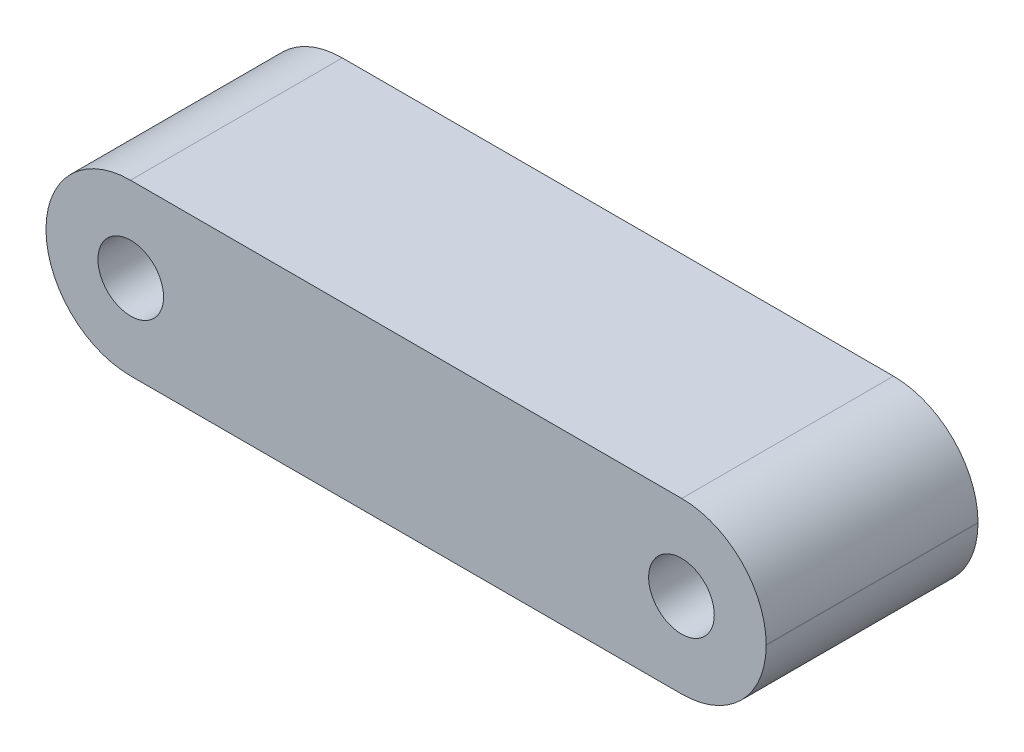
ISO-10303-21;
HEADER;
FILE_DESCRIPTION(('STEP AP214'),'2;1');
FILE_NAME('part.step','',(''),(''),'','','');
FILE_SCHEMA(('AUTOMOTIVE_DESIGN { 1 0 10303 214 1 1 1 1 }'));
ENDSEC;
DATA;
#1=APPLICATION_CONTEXT('core data for automotive mechanical design processes');
#2=APPLICATION_PROTOCOL_DEFINITION('international standard','automotive_design',2000,#1);
#3=PRODUCT_CONTEXT('',#1,'mechanical');
#4=PRODUCT('Part','Part','',(#3));
#5=PRODUCT_RELATED_PRODUCT_CATEGORY('part','',(#4));
#6=PRODUCT_DEFINITION_FORMATION('','',#4);
#7=PRODUCT_DEFINITION_CONTEXT('part definition',#1,'design');
#8=PRODUCT_DEFINITION('design','',#6,#7);
#9=PRODUCT_DEFINITION_SHAPE('','',#8);
#10=(LENGTH_UNIT() NAMED_UNIT(*) SI_UNIT(.MILLI.,.METRE.));
#11=(NAMED_UNIT(*) PLANE_ANGLE_UNIT() SI_UNIT($,.RADIAN.));
#12=(NAMED_UNIT(*) SI_UNIT($,.STERADIAN.) SOLID_ANGLE_UNIT());
#13=UNCERTAINTY_MEASURE_WITH_UNIT(LENGTH_MEASURE(1.E-05),#10,'distance_accuracy_value','');
#14=(GEOMETRIC_REPRESENTATION_CONTEXT(3) GLOBAL_UNCERTAINTY_ASSIGNED_CONTEXT((#13)) GLOBAL_UNIT_ASSIGNED_CONTEXT((#10,
#11,#12)) REPRESENTATION_CONTEXT('',''));
#15=CARTESIAN_POINT('',(0.,0.,0.));
#16=DIRECTION('',(0.,0.,1.));
#17=DIRECTION('',(1.,0.,0.));
#18=AXIS2_PLACEMENT_3D('',#15,#16,#17);
#19=CARTESIAN_POINT('',(126.29,97.1743117146727,10.));
#20=DIRECTION('',(0.,0.,-1.));
#21=DIRECTION('',(-1.,0.,0.));
#22=AXIS2_PLACEMENT_3D('',#19,#20,#21);
#23=CYLINDRICAL_SURFACE('',#22,3.98999999999999);
#24=CARTESIAN_POINT('',(126.29,97.1743117146727,0.));
#25=DIRECTION('',(0.,0.,1.));
#26=DIRECTION('',(1.,0.,0.));
#27=AXIS2_PLACEMENT_3D('',#24,#25,#26);
#28=CIRCLE('',#27,3.98999999999999);
#29=CARTESIAN_POINT('',(122.3,97.1743117146727,0.));
#30=VERTEX_POINT('',#29);
#31=CARTESIAN_POINT('',(126.29,93.1843117146727,0.));
#32=VERTEX_POINT('',#31);
#33=EDGE_CURVE('E131',#30,#32,#28,.T.);
#34=ORIENTED_EDGE('',*,*,#33,.T.);
#35=DIRECTION('',(0.,0.,-1.));
#36=VECTOR('',#35,1.);
#37=CARTESIAN_POINT('',(126.29,93.1843117146727,10.));
#38=LINE('',#37,#36);
#39=CARTESIAN_POINT('',(126.29,93.1843117146727,10.));
#40=VERTEX_POINT('',#39);
#41=EDGE_CURVE('E11',#40,#32,#38,.T.);
#42=ORIENTED_EDGE('',*,*,#41,.F.);
#43=CARTESIAN_POINT('',(126.29,97.1743117146727,10.));
#44=DIRECTION('',(0.,0.,1.));
#45=DIRECTION('',(1.,0.,0.));
#46=AXIS2_PLACEMENT_3D('',#43,#44,#45);
#47=CIRCLE('',#46,3.98999999999999);
#48=CARTESIAN_POINT('',(122.3,97.1743117146727,10.));
#49=VERTEX_POINT('',#48);
#50=EDGE_CURVE('E146',#49,#40,#47,.T.);
#51=ORIENTED_EDGE('',*,*,#50,.F.);
#52=DIRECTION('',(0.,0.,-1.));
#53=VECTOR('',#52,1.);
#54=CARTESIAN_POINT('',(122.3,97.1743117146727,10.));
#55=LINE('',#54,#53);
#56=EDGE_CURVE('E127',#49,#30,#55,.T.);
#57=ORIENTED_EDGE('',*,*,#56,.T.);
#58=EDGE_LOOP('',(#34,#42,#51,#57));
#59=FACE_BOUND('',#58,.T.);
#60=ADVANCED_FACE('F35',(#59),#23,.T.);
#61=CARTESIAN_POINT('',(152.31,93.1843117146727,10.));
#62=DIRECTION('',(0.,1.,0.));
#63=DIRECTION('',(0.,0.,1.));
#64=AXIS2_PLACEMENT_3D('',#61,#62,#63);
#65=PLANE('',#64);
#66=DIRECTION('',(1.,0.,0.));
#67=VECTOR('',#66,1.);
#68=CARTESIAN_POINT('',(152.31,93.1843117146727,0.));
#69=LINE('',#68,#67);
#70=CARTESIAN_POINT('',(152.31,93.1843117146727,0.));
#71=VERTEX_POINT('',#70);
#72=EDGE_CURVE('E134',#32,#71,#69,.T.);
#73=ORIENTED_EDGE('',*,*,#72,.T.);
#74=DIRECTION('',(0.,0.,-1.));
#75=VECTOR('',#74,1.);
#76=CARTESIAN_POINT('',(152.31,93.1843117146727,10.));
#77=LINE('',#76,#75);
#78=CARTESIAN_POINT('',(152.31,93.1843117146727,10.));
#79=VERTEX_POINT('',#78);
#80=EDGE_CURVE('E43',#79,#71,#77,.T.);
#81=ORIENTED_EDGE('',*,*,#80,.F.);
#82=DIRECTION('',(1.,0.,0.));
#83=VECTOR('',#82,1.);
#84=CARTESIAN_POINT('',(152.31,93.1843117146727,10.));
#85=LINE('',#84,#83);
#86=EDGE_CURVE('E94',#40,#79,#85,.T.);
#87=ORIENTED_EDGE('',*,*,#86,.F.);
#88=ORIENTED_EDGE('',*,*,#41,.T.);
#89=EDGE_LOOP('',(#73,#81,#87,#88));
#90=FACE_BOUND('',#89,.T.);
#91=ADVANCED_FACE('F215',(#90),#65,.F.);
#92=CARTESIAN_POINT('',(152.31,97.1743117146727,10.));
#93=DIRECTION('',(0.,0.,-1.));
#94=DIRECTION('',(-1.,0.,0.));
#95=AXIS2_PLACEMENT_3D('',#92,#93,#94);
#96=CYLINDRICAL_SURFACE('',#95,3.98999999999999);
#97=CARTESIAN_POINT('',(152.31,97.1743117146727,0.));
#98=DIRECTION('',(0.,0.,1.));
#99=DIRECTION('',(-1.,0.,0.));
#100=AXIS2_PLACEMENT_3D('',#97,#98,#99);
#101=CIRCLE('',#100,3.98999999999999);
#102=CARTESIAN_POINT('',(156.3,97.1743117146727,0.));
#103=VERTEX_POINT('',#102);
#104=EDGE_CURVE('E137',#71,#103,#101,.T.);
#105=ORIENTED_EDGE('',*,*,#104,.T.);
#106=DIRECTION('',(0.,0.,-1.));
#107=VECTOR('',#106,1.);
#108=CARTESIAN_POINT('',(156.3,97.1743117146727,10.));
#109=LINE('',#108,#107);
#110=CARTESIAN_POINT('',(156.3,97.1743117146727,10.));
#111=VERTEX_POINT('',#110);
#112=EDGE_CURVE('E153',#111,#103,#109,.T.);
#113=ORIENTED_EDGE('',*,*,#112,.F.);
#114=CARTESIAN_POINT('',(152.31,97.1743117146727,10.));
#115=DIRECTION('',(0.,0.,1.));
#116=DIRECTION('',(-1.,0.,0.));
#117=AXIS2_PLACEMENT_3D('',#114,#115,#116);
#118=CIRCLE('',#117,3.98999999999999);
#119=EDGE_CURVE('E161',#79,#111,#118,.T.);
#120=ORIENTED_EDGE('',*,*,#119,.F.);
#121=ORIENTED_EDGE('',*,*,#80,.T.);
#122=EDGE_LOOP('',(#105,#113,#120,#121));
#123=FACE_BOUND('',#122,.T.);
#124=ADVANCED_FACE('F159',(#123),#96,.T.);
#125=CARTESIAN_POINT('',(156.3,97.1943117146728,10.));
#126=DIRECTION('',(-1.,0.,0.));
#127=DIRECTION('',(0.,0.,1.));
#128=AXIS2_PLACEMENT_3D('',#125,#126,#127);
#129=PLANE('',#128);
#130=DIRECTION('',(0.,1.,0.));
#131=VECTOR('',#130,1.);
#132=CARTESIAN_POINT('',(156.3,97.1943117146728,0.));
#133=LINE('',#132,#131);
#134=CARTESIAN_POINT('',(156.3,97.1943117146728,0.));
#135=VERTEX_POINT('',#134);
#136=EDGE_CURVE('E139',#103,#135,#133,.T.);
#137=ORIENTED_EDGE('',*,*,#136,.T.);
#138=DIRECTION('',(0.,0.,-1.));
#139=VECTOR('',#138,1.);
#140=CARTESIAN_POINT('',(156.3,97.1943117146728,10.));
#141=LINE('',#140,#139);
#142=CARTESIAN_POINT('',(156.3,97.1943117146728,10.));
#143=VERTEX_POINT('',#142);
#144=EDGE_CURVE('E150',#143,#135,#141,.T.);
#145=ORIENTED_EDGE('',*,*,#144,.F.);
#146=DIRECTION('',(0.,1.,0.));
#147=VECTOR('',#146,1.);
#148=CARTESIAN_POINT('',(156.3,97.1943117146728,10.));
#149=LINE('',#148,#147);
#150=EDGE_CURVE('E173',#111,#143,#149,.T.);
#151=ORIENTED_EDGE('',*,*,#150,.F.);
#152=ORIENTED_EDGE('',*,*,#112,.T.);
#153=EDGE_LOOP('',(#137,#145,#151,#152));
#154=FACE_BOUND('',#153,.T.);
#155=ADVANCED_FACE('F169',(#154),#129,.F.);
#156=CARTESIAN_POINT('',(152.31,97.1943117146728,10.));
#157=DIRECTION('',(0.,0.,-1.));
#158=DIRECTION('',(-1.,0.,0.));
#159=AXIS2_PLACEMENT_3D('',#156,#157,#158);
#160=CYLINDRICAL_SURFACE('',#159,3.98999999999999);
#161=CARTESIAN_POINT('',(152.31,97.1943117146728,0.));
#162=DIRECTION('',(0.,0.,1.));
#163=DIRECTION('',(1.,0.,0.));
#164=AXIS2_PLACEMENT_3D('',#161,#162,#163);
#165=CIRCLE('',#164,3.98999999999999);
#166=CARTESIAN_POINT('',(152.31,101.184311714673,0.));
#167=VERTEX_POINT('',#166);
#168=EDGE_CURVE('E141',#135,#167,#165,.T.);
#169=ORIENTED_EDGE('',*,*,#168,.T.);
#170=DIRECTION('',(0.,0.,-1.));
#171=VECTOR('',#170,1.);
#172=CARTESIAN_POINT('',(152.31,101.184311714673,10.));
#173=LINE('',#172,#171);
#174=CARTESIAN_POINT('',(152.31,101.184311714673,10.));
#175=VERTEX_POINT('',#174);
#176=EDGE_CURVE('E122',#175,#167,#173,.T.);
#177=ORIENTED_EDGE('',*,*,#176,.F.);
#178=CARTESIAN_POINT('',(152.31,97.1943117146728,10.));
#179=DIRECTION('',(0.,0.,1.));
#180=DIRECTION('',(1.,0.,0.));
#181=AXIS2_PLACEMENT_3D('',#178,#179,#180);
#182=CIRCLE('',#181,3.98999999999999);
#183=EDGE_CURVE('E113',#143,#175,#182,.T.);
#184=ORIENTED_EDGE('',*,*,#183,.F.);
#185=ORIENTED_EDGE('',*,*,#144,.T.);
#186=EDGE_LOOP('',(#169,#177,#184,#185));
#187=FACE_BOUND('',#186,.T.);
#188=ADVANCED_FACE('F172',(#187),#160,.T.);
#189=CARTESIAN_POINT('',(152.31,101.184311714673,10.));
#190=DIRECTION('',(0.,-1.,0.));
#191=DIRECTION('',(0.,0.,-1.));
#192=AXIS2_PLACEMENT_3D('',#189,#190,#191);
#193=PLANE('',#192);
#194=DIRECTION('',(-1.,0.,0.));
#195=VECTOR('',#194,1.);
#196=CARTESIAN_POINT('',(152.31,101.184311714673,0.));
#197=LINE('',#196,#195);
#198=CARTESIAN_POINT('',(126.29,101.184311714673,0.));
#199=VERTEX_POINT('',#198);
#200=EDGE_CURVE('E121',#167,#199,#197,.T.);
#201=ORIENTED_EDGE('',*,*,#200,.T.);
#202=DIRECTION('',(0.,0.,-1.));
#203=VECTOR('',#202,1.);
#204=CARTESIAN_POINT('',(126.29,101.184311714673,10.));
#205=LINE('',#204,#203);
#206=CARTESIAN_POINT('',(126.29,101.184311714673,10.));
#207=VERTEX_POINT('',#206);
#208=EDGE_CURVE('E118',#207,#199,#205,.T.);
#209=ORIENTED_EDGE('',*,*,#208,.F.);
#210=DIRECTION('',(-1.,0.,0.));
#211=VECTOR('',#210,1.);
#212=CARTESIAN_POINT('',(152.31,101.184311714673,10.));
#213=LINE('',#212,#211);
#214=EDGE_CURVE('E107',#175,#207,#213,.T.);
#215=ORIENTED_EDGE('',*,*,#214,.F.);
#216=ORIENTED_EDGE('',*,*,#176,.T.);
#217=EDGE_LOOP('',(#201,#209,#215,#216));
#218=FACE_BOUND('',#217,.T.);
#219=ADVANCED_FACE('F119',(#218),#193,.F.);
#220=CARTESIAN_POINT('',(126.29,97.1943117146728,10.));
#221=DIRECTION('',(0.,0.,-1.));
#222=DIRECTION('',(-1.,0.,0.));
#223=AXIS2_PLACEMENT_3D('',#220,#221,#222);
#224=CYLINDRICAL_SURFACE('',#223,3.98999999999999);
#225=CARTESIAN_POINT('',(126.29,97.1943117146728,0.));
#226=DIRECTION('',(0.,0.,1.));
#227=DIRECTION('',(1.,0.,0.));
#228=AXIS2_PLACEMENT_3D('',#225,#226,#227);
#229=CIRCLE('',#228,3.98999999999999);
#230=CARTESIAN_POINT('',(122.3,97.1943117146728,0.));
#231=VERTEX_POINT('',#230);
#232=EDGE_CURVE('E80',#199,#231,#229,.T.);
#233=ORIENTED_EDGE('',*,*,#232,.T.);
#234=DIRECTION('',(0.,0.,-1.));
#235=VECTOR('',#234,1.);
#236=CARTESIAN_POINT('',(122.3,97.1943117146728,10.));
#237=LINE('',#236,#235);
#238=CARTESIAN_POINT('',(122.3,97.1943117146728,10.));
#239=VERTEX_POINT('',#238);
#240=EDGE_CURVE('E123',#239,#231,#237,.T.);
#241=ORIENTED_EDGE('',*,*,#240,.F.);
#242=CARTESIAN_POINT('',(126.29,97.1943117146728,10.));
#243=DIRECTION('',(0.,0.,1.));
#244=DIRECTION('',(1.,0.,0.));
#245=AXIS2_PLACEMENT_3D('',#242,#243,#244);
#246=CIRCLE('',#245,3.98999999999999);
#247=EDGE_CURVE('E111',#207,#239,#246,.T.);
#248=ORIENTED_EDGE('',*,*,#247,.F.);
#249=ORIENTED_EDGE('',*,*,#208,.T.);
#250=EDGE_LOOP('',(#233,#241,#248,#249));
#251=FACE_BOUND('',#250,.T.);
#252=ADVANCED_FACE('F125',(#251),#224,.T.);
#253=CARTESIAN_POINT('',(122.3,97.1943117146728,10.));
#254=DIRECTION('',(1.,0.,0.));
#255=DIRECTION('',(0.,0.,-1.));
#256=AXIS2_PLACEMENT_3D('',#253,#254,#255);
#257=PLANE('',#256);
#258=DIRECTION('',(0.,-1.,0.));
#259=VECTOR('',#258,1.);
#260=CARTESIAN_POINT('',(122.3,97.1943117146728,0.));
#261=LINE('',#260,#259);
#262=EDGE_CURVE('E86',#231,#30,#261,.T.);
#263=ORIENTED_EDGE('',*,*,#262,.T.);
#264=ORIENTED_EDGE('',*,*,#56,.F.);
#265=DIRECTION('',(0.,-1.,0.));
#266=VECTOR('',#265,1.);
#267=CARTESIAN_POINT('',(122.3,97.1943117146728,10.));
#268=LINE('',#267,#266);
#269=EDGE_CURVE('E51',#239,#49,#268,.T.);
#270=ORIENTED_EDGE('',*,*,#269,.F.);
#271=ORIENTED_EDGE('',*,*,#240,.T.);
#272=EDGE_LOOP('',(#263,#264,#270,#271));
#273=FACE_BOUND('',#272,.T.);
#274=ADVANCED_FACE('F202',(#273),#257,.F.);
#275=CARTESIAN_POINT('',(126.29,97.1743117146727,10.));
#276=DIRECTION('',(0.,0.,1.));
#277=DIRECTION('',(1.,0.,0.));
#278=AXIS2_PLACEMENT_3D('',#275,#276,#277);
#279=PLANE('',#278);
#280=CARTESIAN_POINT('',(126.3,97.1843117146727,10.));
#281=DIRECTION('',(0.,0.,1.));
#282=DIRECTION('',(1.,0.,0.));
#283=AXIS2_PLACEMENT_3D('',#280,#281,#282);
#284=CIRCLE('',#283,1.54999999999997);
#285=CARTESIAN_POINT('',(127.85,97.1843117146727,10.));
#286=VERTEX_POINT('',#285);
#287=EDGE_CURVE('E185',#286,#286,#284,.T.);
#288=ORIENTED_EDGE('',*,*,#287,.F.);
#289=EDGE_LOOP('',(#288));
#290=FACE_BOUND('',#289,.T.);
#291=CARTESIAN_POINT('',(152.3,97.1843117146727,10.));
#292=DIRECTION('',(0.,0.,1.));
#293=DIRECTION('',(1.,0.,0.));
#294=AXIS2_PLACEMENT_3D('',#291,#292,#293);
#295=CIRCLE('',#294,1.54999999999997);
#296=CARTESIAN_POINT('',(153.85,97.1843117146727,10.));
#297=VERTEX_POINT('',#296);
#298=EDGE_CURVE('E179',#297,#297,#295,.T.);
#299=ORIENTED_EDGE('',*,*,#298,.F.);
#300=EDGE_LOOP('',(#299));
#301=FACE_BOUND('',#300,.T.);
#302=ORIENTED_EDGE('',*,*,#50,.T.);
#303=ORIENTED_EDGE('',*,*,#86,.T.);
#304=ORIENTED_EDGE('',*,*,#119,.T.);
#305=ORIENTED_EDGE('',*,*,#150,.T.);
#306=ORIENTED_EDGE('',*,*,#183,.T.);
#307=ORIENTED_EDGE('',*,*,#214,.T.);
#308=ORIENTED_EDGE('',*,*,#247,.T.);
#309=ORIENTED_EDGE('',*,*,#269,.T.);
#310=EDGE_LOOP('',(#302,#303,#304,#305,#306,#307,#308,#309));
#311=FACE_BOUND('',#310,.T.);
#312=ADVANCED_FACE('F109',(#290,#301,#311),#279,.T.);
#313=CARTESIAN_POINT('',(126.29,97.1743117146727,0.));
#314=DIRECTION('',(0.,0.,1.));
#315=DIRECTION('',(1.,0.,0.));
#316=AXIS2_PLACEMENT_3D('',#313,#314,#315);
#317=PLANE('',#316);
#318=CARTESIAN_POINT('',(126.3,97.1843117146727,0.));
#319=DIRECTION('',(0.,0.,1.));
#320=DIRECTION('',(1.,0.,0.));
#321=AXIS2_PLACEMENT_3D('',#318,#319,#320);
#322=CIRCLE('',#321,1.54999999999997);
#323=CARTESIAN_POINT('',(127.85,97.1843117146727,0.));
#324=VERTEX_POINT('',#323);
#325=EDGE_CURVE('E182',#324,#324,#322,.T.);
#326=ORIENTED_EDGE('',*,*,#325,.T.);
#327=EDGE_LOOP('',(#326));
#328=FACE_BOUND('',#327,.T.);
#329=CARTESIAN_POINT('',(152.3,97.1843117146727,0.));
#330=DIRECTION('',(0.,0.,1.));
#331=DIRECTION('',(1.,0.,0.));
#332=AXIS2_PLACEMENT_3D('',#329,#330,#331);
#333=CIRCLE('',#332,1.54999999999997);
#334=CARTESIAN_POINT('',(153.85,97.1843117146727,0.));
#335=VERTEX_POINT('',#334);
#336=EDGE_CURVE('E135',#335,#335,#333,.T.);
#337=ORIENTED_EDGE('',*,*,#336,.T.);
#338=EDGE_LOOP('',(#337));
#339=FACE_BOUND('',#338,.T.);
#340=ORIENTED_EDGE('',*,*,#33,.F.);
#341=ORIENTED_EDGE('',*,*,#262,.F.);
#342=ORIENTED_EDGE('',*,*,#232,.F.);
#343=ORIENTED_EDGE('',*,*,#200,.F.);
#344=ORIENTED_EDGE('',*,*,#168,.F.);
#345=ORIENTED_EDGE('',*,*,#136,.F.);
#346=ORIENTED_EDGE('',*,*,#104,.F.);
#347=ORIENTED_EDGE('',*,*,#72,.F.);
#348=EDGE_LOOP('',(#340,#341,#342,#343,#344,#345,#346,#347));
#349=FACE_BOUND('',#348,.T.);
#350=ADVANCED_FACE('F165',(#328,#339,#349),#317,.F.);
#351=CARTESIAN_POINT('',(152.3,97.1843117146727,0.));
#352=DIRECTION('',(0.,0.,1.));
#353=DIRECTION('',(1.,0.,0.));
#354=AXIS2_PLACEMENT_3D('',#351,#352,#353);
#355=CYLINDRICAL_SURFACE('',#354,1.54999999999997);
#356=ORIENTED_EDGE('',*,*,#336,.F.);
#357=EDGE_LOOP('',(#356));
#358=FACE_BOUND('',#357,.T.);
#359=ORIENTED_EDGE('',*,*,#298,.T.);
#360=EDGE_LOOP('',(#359));
#361=FACE_BOUND('',#360,.T.);
#362=ADVANCED_FACE('F196',(#358,#361),#355,.F.);
#363=CARTESIAN_POINT('',(126.3,97.1843117146727,0.));
#364=DIRECTION('',(0.,0.,1.));
#365=DIRECTION('',(1.,0.,0.));
#366=AXIS2_PLACEMENT_3D('',#363,#364,#365);
#367=CYLINDRICAL_SURFACE('',#366,1.54999999999997);
#368=ORIENTED_EDGE('',*,*,#325,.F.);
#369=EDGE_LOOP('',(#368));
#370=FACE_BOUND('',#369,.T.);
#371=ORIENTED_EDGE('',*,*,#287,.T.);
#372=EDGE_LOOP('',(#371));
#373=FACE_BOUND('',#372,.T.);
#374=ADVANCED_FACE('F193',(#370,#373),#367,.F.);
#375=CLOSED_SHELL('',(#60,#91,#124,#155,#188,#219,#252,#274,#312,#350,#362,#374));
#376=MANIFOLD_SOLID_BREP('B2',#375);
#377=ADVANCED_BREP_SHAPE_REPRESENTATION('',(#18,#376),#14);
#378=SHAPE_DEFINITION_REPRESENTATION(#9,#377);
ENDSEC;
END-ISO-10303-21;
